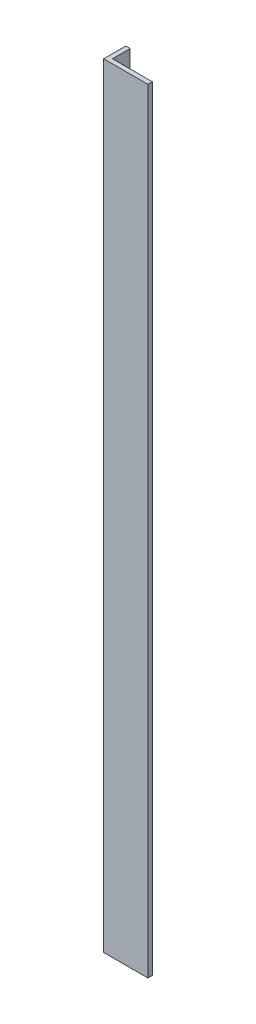
ISO-10303-21;
HEADER;
FILE_DESCRIPTION(('STEP AP214'),'2;1');
FILE_NAME('part.step','',(''),(''),'','','');
FILE_SCHEMA(('AUTOMOTIVE_DESIGN { 1 0 10303 214 1 1 1 1 }'));
ENDSEC;
DATA;
#1=APPLICATION_CONTEXT('core data for automotive mechanical design processes');
#2=APPLICATION_PROTOCOL_DEFINITION('international standard','automotive_design',2000,#1);
#3=PRODUCT_CONTEXT('',#1,'mechanical');
#4=PRODUCT('Part','Part','',(#3));
#5=PRODUCT_RELATED_PRODUCT_CATEGORY('part','',(#4));
#6=PRODUCT_DEFINITION_FORMATION('','',#4);
#7=PRODUCT_DEFINITION_CONTEXT('part definition',#1,'design');
#8=PRODUCT_DEFINITION('design','',#6,#7);
#9=PRODUCT_DEFINITION_SHAPE('','',#8);
#10=(LENGTH_UNIT() NAMED_UNIT(*) SI_UNIT(.MILLI.,.METRE.));
#11=(NAMED_UNIT(*) PLANE_ANGLE_UNIT() SI_UNIT($,.RADIAN.));
#12=(NAMED_UNIT(*) SI_UNIT($,.STERADIAN.) SOLID_ANGLE_UNIT());
#13=UNCERTAINTY_MEASURE_WITH_UNIT(LENGTH_MEASURE(1.E-05),#10,'distance_accuracy_value','');
#14=(GEOMETRIC_REPRESENTATION_CONTEXT(3) GLOBAL_UNCERTAINTY_ASSIGNED_CONTEXT((#13)) GLOBAL_UNIT_ASSIGNED_CONTEXT((#10,
#11,#12)) REPRESENTATION_CONTEXT('',''));
#15=CARTESIAN_POINT('',(0.,0.,0.));
#16=DIRECTION('',(0.,0.,1.));
#17=DIRECTION('',(1.,0.,0.));
#18=AXIS2_PLACEMENT_3D('',#15,#16,#17);
#19=CARTESIAN_POINT('',(20.,350.,0.));
#20=DIRECTION('',(0.,0.,-1.));
#21=DIRECTION('',(-1.,0.,0.));
#22=AXIS2_PLACEMENT_3D('',#19,#20,#21);
#23=PLANE('',#22);
#24=DIRECTION('',(1.,0.,0.));
#25=VECTOR('',#24,1.);
#26=CARTESIAN_POINT('',(20.,0.,0.));
#27=LINE('',#26,#25);
#28=CARTESIAN_POINT('',(0.,0.,0.));
#29=VERTEX_POINT('',#28);
#30=CARTESIAN_POINT('',(20.,0.,0.));
#31=VERTEX_POINT('',#30);
#32=EDGE_CURVE('E119',#29,#31,#27,.T.);
#33=ORIENTED_EDGE('',*,*,#32,.T.);
#34=DIRECTION('',(0.,-1.,0.));
#35=VECTOR('',#34,1.);
#36=CARTESIAN_POINT('',(20.,350.,0.));
#37=LINE('',#36,#35);
#38=CARTESIAN_POINT('',(20.,350.,0.));
#39=VERTEX_POINT('',#38);
#40=EDGE_CURVE('E11',#39,#31,#37,.T.);
#41=ORIENTED_EDGE('',*,*,#40,.F.);
#42=DIRECTION('',(1.,0.,0.));
#43=VECTOR('',#42,1.);
#44=CARTESIAN_POINT('',(20.,350.,0.));
#45=LINE('',#44,#43);
#46=CARTESIAN_POINT('',(0.,350.,0.));
#47=VERTEX_POINT('',#46);
#48=EDGE_CURVE('E130',#47,#39,#45,.T.);
#49=ORIENTED_EDGE('',*,*,#48,.F.);
#50=DIRECTION('',(0.,-1.,0.));
#51=VECTOR('',#50,1.);
#52=CARTESIAN_POINT('',(0.,350.,0.));
#53=LINE('',#52,#51);
#54=EDGE_CURVE('E115',#47,#29,#53,.T.);
#55=ORIENTED_EDGE('',*,*,#54,.T.);
#56=EDGE_LOOP('',(#33,#41,#49,#55));
#57=FACE_BOUND('',#56,.T.);
#58=ADVANCED_FACE('F35',(#57),#23,.F.);
#59=CARTESIAN_POINT('',(20.,350.,-2.));
#60=DIRECTION('',(-1.,0.,0.));
#61=DIRECTION('',(0.,0.,1.));
#62=AXIS2_PLACEMENT_3D('',#59,#60,#61);
#63=PLANE('',#62);
#64=DIRECTION('',(0.,0.,-1.));
#65=VECTOR('',#64,1.);
#66=CARTESIAN_POINT('',(20.,0.,-2.));
#67=LINE('',#66,#65);
#68=CARTESIAN_POINT('',(20.,0.,-2.));
#69=VERTEX_POINT('',#68);
#70=EDGE_CURVE('E122',#31,#69,#67,.T.);
#71=ORIENTED_EDGE('',*,*,#70,.T.);
#72=DIRECTION('',(0.,-1.,0.));
#73=VECTOR('',#72,1.);
#74=CARTESIAN_POINT('',(20.,350.,-2.));
#75=LINE('',#74,#73);
#76=CARTESIAN_POINT('',(20.,350.,-2.));
#77=VERTEX_POINT('',#76);
#78=EDGE_CURVE('E43',#77,#69,#75,.T.);
#79=ORIENTED_EDGE('',*,*,#78,.F.);
#80=DIRECTION('',(0.,0.,-1.));
#81=VECTOR('',#80,1.);
#82=CARTESIAN_POINT('',(20.,350.,-2.));
#83=LINE('',#82,#81);
#84=EDGE_CURVE('E88',#39,#77,#83,.T.);
#85=ORIENTED_EDGE('',*,*,#84,.F.);
#86=ORIENTED_EDGE('',*,*,#40,.T.);
#87=EDGE_LOOP('',(#71,#79,#85,#86));
#88=FACE_BOUND('',#87,.T.);
#89=ADVANCED_FACE('F159',(#88),#63,.F.);
#90=CARTESIAN_POINT('',(2.,350.,-2.));
#91=DIRECTION('',(0.,0.,1.));
#92=DIRECTION('',(1.,0.,0.));
#93=AXIS2_PLACEMENT_3D('',#90,#91,#92);
#94=PLANE('',#93);
#95=DIRECTION('',(-1.,0.,0.));
#96=VECTOR('',#95,1.);
#97=CARTESIAN_POINT('',(2.,0.,-2.));
#98=LINE('',#97,#96);
#99=CARTESIAN_POINT('',(2.,0.,-2.));
#100=VERTEX_POINT('',#99);
#101=EDGE_CURVE('E125',#69,#100,#98,.T.);
#102=ORIENTED_EDGE('',*,*,#101,.T.);
#103=DIRECTION('',(0.,-1.,0.));
#104=VECTOR('',#103,1.);
#105=CARTESIAN_POINT('',(2.,350.,-2.));
#106=LINE('',#105,#104);
#107=CARTESIAN_POINT('',(2.,350.,-2.));
#108=VERTEX_POINT('',#107);
#109=EDGE_CURVE('E110',#108,#100,#106,.T.);
#110=ORIENTED_EDGE('',*,*,#109,.F.);
#111=DIRECTION('',(-1.,0.,0.));
#112=VECTOR('',#111,1.);
#113=CARTESIAN_POINT('',(2.,350.,-2.));
#114=LINE('',#113,#112);
#115=EDGE_CURVE('E101',#77,#108,#114,.T.);
#116=ORIENTED_EDGE('',*,*,#115,.F.);
#117=ORIENTED_EDGE('',*,*,#78,.T.);
#118=EDGE_LOOP('',(#102,#110,#116,#117));
#119=FACE_BOUND('',#118,.T.);
#120=ADVANCED_FACE('F136',(#119),#94,.F.);
#121=CARTESIAN_POINT('',(2.,350.,-10.));
#122=DIRECTION('',(-1.,0.,0.));
#123=DIRECTION('',(0.,0.,1.));
#124=AXIS2_PLACEMENT_3D('',#121,#122,#123);
#125=PLANE('',#124);
#126=CARTESIAN_POINT('',(2.,344.,-5.99999999999998));
#127=DIRECTION('',(1.,0.,0.));
#128=DIRECTION('',(0.,0.,-1.));
#129=AXIS2_PLACEMENT_3D('',#126,#127,#128);
#130=CIRCLE('',#129,1.5);
#131=CARTESIAN_POINT('',(2.,344.,-7.49999999999998));
#132=VERTEX_POINT('',#131);
#133=EDGE_CURVE('E175',#132,#132,#130,.T.);
#134=ORIENTED_EDGE('',*,*,#133,.F.);
#135=EDGE_LOOP('',(#134));
#136=FACE_BOUND('',#135,.T.);
#137=CARTESIAN_POINT('',(2.,330.,-5.99999999999998));
#138=DIRECTION('',(1.,0.,0.));
#139=DIRECTION('',(0.,0.,-1.));
#140=AXIS2_PLACEMENT_3D('',#137,#138,#139);
#141=CIRCLE('',#140,1.5);
#142=CARTESIAN_POINT('',(2.,330.,-7.49999999999998));
#143=VERTEX_POINT('',#142);
#144=EDGE_CURVE('E179',#143,#143,#141,.T.);
#145=ORIENTED_EDGE('',*,*,#144,.F.);
#146=EDGE_LOOP('',(#145));
#147=FACE_BOUND('',#146,.T.);
#148=CARTESIAN_POINT('',(2.,6.00000000000001,-6.00000000000001));
#149=DIRECTION('',(1.,0.,0.));
#150=DIRECTION('',(0.,0.,-1.));
#151=AXIS2_PLACEMENT_3D('',#148,#149,#150);
#152=CIRCLE('',#151,1.49999999999999);
#153=CARTESIAN_POINT('',(2.,6.00000000000001,-7.49999999999999));
#154=VERTEX_POINT('',#153);
#155=EDGE_CURVE('E183',#154,#154,#152,.T.);
#156=ORIENTED_EDGE('',*,*,#155,.F.);
#157=EDGE_LOOP('',(#156));
#158=FACE_BOUND('',#157,.T.);
#159=CARTESIAN_POINT('',(2.,20.,-6.00000000000001));
#160=DIRECTION('',(1.,0.,0.));
#161=DIRECTION('',(0.,0.,-1.));
#162=AXIS2_PLACEMENT_3D('',#159,#160,#161);
#163=CIRCLE('',#162,1.49999999999999);
#164=CARTESIAN_POINT('',(2.,20.,-7.49999999999999));
#165=VERTEX_POINT('',#164);
#166=EDGE_CURVE('E186',#165,#165,#163,.T.);
#167=ORIENTED_EDGE('',*,*,#166,.F.);
#168=EDGE_LOOP('',(#167));
#169=FACE_BOUND('',#168,.T.);
#170=DIRECTION('',(0.,0.,-1.));
#171=VECTOR('',#170,1.);
#172=CARTESIAN_POINT('',(2.,0.,-10.));
#173=LINE('',#172,#171);
#174=CARTESIAN_POINT('',(2.,0.,-10.));
#175=VERTEX_POINT('',#174);
#176=EDGE_CURVE('E109',#100,#175,#173,.T.);
#177=ORIENTED_EDGE('',*,*,#176,.T.);
#178=DIRECTION('',(0.,-1.,0.));
#179=VECTOR('',#178,1.);
#180=CARTESIAN_POINT('',(2.,350.,-10.));
#181=LINE('',#180,#179);
#182=CARTESIAN_POINT('',(2.,350.,-10.));
#183=VERTEX_POINT('',#182);
#184=EDGE_CURVE('E106',#183,#175,#181,.T.);
#185=ORIENTED_EDGE('',*,*,#184,.F.);
#186=DIRECTION('',(0.,0.,-1.));
#187=VECTOR('',#186,1.);
#188=CARTESIAN_POINT('',(2.,350.,-10.));
#189=LINE('',#188,#187);
#190=EDGE_CURVE('E95',#108,#183,#189,.T.);
#191=ORIENTED_EDGE('',*,*,#190,.F.);
#192=ORIENTED_EDGE('',*,*,#109,.T.);
#193=EDGE_LOOP('',(#177,#185,#191,#192));
#194=FACE_BOUND('',#193,.T.);
#195=ADVANCED_FACE('F107',(#136,#147,#158,#169,#194),#125,.F.);
#196=CARTESIAN_POINT('',(0.,350.,-10.));
#197=DIRECTION('',(0.,0.,1.));
#198=DIRECTION('',(1.,0.,0.));
#199=AXIS2_PLACEMENT_3D('',#196,#197,#198);
#200=PLANE('',#199);
#201=DIRECTION('',(-1.,0.,0.));
#202=VECTOR('',#201,1.);
#203=CARTESIAN_POINT('',(0.,0.,-10.));
#204=LINE('',#203,#202);
#205=CARTESIAN_POINT('',(0.,0.,-10.));
#206=VERTEX_POINT('',#205);
#207=EDGE_CURVE('E74',#175,#206,#204,.T.);
#208=ORIENTED_EDGE('',*,*,#207,.T.);
#209=DIRECTION('',(0.,-1.,0.));
#210=VECTOR('',#209,1.);
#211=CARTESIAN_POINT('',(0.,350.,-10.));
#212=LINE('',#211,#210);
#213=CARTESIAN_POINT('',(0.,350.,-10.));
#214=VERTEX_POINT('',#213);
#215=EDGE_CURVE('E111',#214,#206,#212,.T.);
#216=ORIENTED_EDGE('',*,*,#215,.F.);
#217=DIRECTION('',(-1.,0.,0.));
#218=VECTOR('',#217,1.);
#219=CARTESIAN_POINT('',(0.,350.,-10.));
#220=LINE('',#219,#218);
#221=EDGE_CURVE('E99',#183,#214,#220,.T.);
#222=ORIENTED_EDGE('',*,*,#221,.F.);
#223=ORIENTED_EDGE('',*,*,#184,.T.);
#224=EDGE_LOOP('',(#208,#216,#222,#223));
#225=FACE_BOUND('',#224,.T.);
#226=ADVANCED_FACE('F113',(#225),#200,.F.);
#227=CARTESIAN_POINT('',(0.,350.,0.));
#228=DIRECTION('',(1.,0.,0.));
#229=DIRECTION('',(0.,0.,-1.));
#230=AXIS2_PLACEMENT_3D('',#227,#228,#229);
#231=PLANE('',#230);
#232=CARTESIAN_POINT('',(0.,344.,-5.99999999999998));
#233=DIRECTION('',(1.,0.,0.));
#234=DIRECTION('',(0.,0.,-1.));
#235=AXIS2_PLACEMENT_3D('',#232,#233,#234);
#236=CIRCLE('',#235,1.5);
#237=CARTESIAN_POINT('',(0.,344.,-7.49999999999998));
#238=VERTEX_POINT('',#237);
#239=EDGE_CURVE('E202',#238,#238,#236,.T.);
#240=ORIENTED_EDGE('',*,*,#239,.T.);
#241=EDGE_LOOP('',(#240));
#242=FACE_BOUND('',#241,.T.);
#243=CARTESIAN_POINT('',(0.,330.,-5.99999999999998));
#244=DIRECTION('',(1.,0.,0.));
#245=DIRECTION('',(0.,0.,-1.));
#246=AXIS2_PLACEMENT_3D('',#243,#244,#245);
#247=CIRCLE('',#246,1.5);
#248=CARTESIAN_POINT('',(0.,330.,-7.49999999999998));
#249=VERTEX_POINT('',#248);
#250=EDGE_CURVE('E198',#249,#249,#247,.T.);
#251=ORIENTED_EDGE('',*,*,#250,.T.);
#252=EDGE_LOOP('',(#251));
#253=FACE_BOUND('',#252,.T.);
#254=CARTESIAN_POINT('',(0.,6.00000000000001,-6.00000000000001));
#255=DIRECTION('',(1.,0.,0.));
#256=DIRECTION('',(0.,0.,-1.));
#257=AXIS2_PLACEMENT_3D('',#254,#255,#256);
#258=CIRCLE('',#257,1.49999999999999);
#259=CARTESIAN_POINT('',(0.,6.00000000000001,-7.49999999999999));
#260=VERTEX_POINT('',#259);
#261=EDGE_CURVE('E188',#260,#260,#258,.T.);
#262=ORIENTED_EDGE('',*,*,#261,.T.);
#263=EDGE_LOOP('',(#262));
#264=FACE_BOUND('',#263,.T.);
#265=CARTESIAN_POINT('',(0.,20.,-6.00000000000001));
#266=DIRECTION('',(1.,0.,0.));
#267=DIRECTION('',(0.,0.,-1.));
#268=AXIS2_PLACEMENT_3D('',#265,#266,#267);
#269=CIRCLE('',#268,1.49999999999999);
#270=CARTESIAN_POINT('',(0.,20.,-7.49999999999999));
#271=VERTEX_POINT('',#270);
#272=EDGE_CURVE('E123',#271,#271,#269,.T.);
#273=ORIENTED_EDGE('',*,*,#272,.T.);
#274=EDGE_LOOP('',(#273));
#275=FACE_BOUND('',#274,.T.);
#276=DIRECTION('',(0.,0.,1.));
#277=VECTOR('',#276,1.);
#278=CARTESIAN_POINT('',(0.,0.,0.));
#279=LINE('',#278,#277);
#280=EDGE_CURVE('E80',#206,#29,#279,.T.);
#281=ORIENTED_EDGE('',*,*,#280,.T.);
#282=ORIENTED_EDGE('',*,*,#54,.F.);
#283=DIRECTION('',(0.,0.,1.));
#284=VECTOR('',#283,1.);
#285=CARTESIAN_POINT('',(0.,350.,0.));
#286=LINE('',#285,#284);
#287=EDGE_CURVE('E51',#214,#47,#286,.T.);
#288=ORIENTED_EDGE('',*,*,#287,.F.);
#289=ORIENTED_EDGE('',*,*,#215,.T.);
#290=EDGE_LOOP('',(#281,#282,#288,#289));
#291=FACE_BOUND('',#290,.T.);
#292=ADVANCED_FACE('F143',(#242,#253,#264,#275,#291),#231,.F.);
#293=CARTESIAN_POINT('',(0.,350.,0.));
#294=DIRECTION('',(0.,-1.,0.));
#295=DIRECTION('',(0.,0.,-1.));
#296=AXIS2_PLACEMENT_3D('',#293,#294,#295);
#297=PLANE('',#296);
#298=ORIENTED_EDGE('',*,*,#48,.T.);
#299=ORIENTED_EDGE('',*,*,#84,.T.);
#300=ORIENTED_EDGE('',*,*,#115,.T.);
#301=ORIENTED_EDGE('',*,*,#190,.T.);
#302=ORIENTED_EDGE('',*,*,#221,.T.);
#303=ORIENTED_EDGE('',*,*,#287,.T.);
#304=EDGE_LOOP('',(#298,#299,#300,#301,#302,#303));
#305=FACE_BOUND('',#304,.T.);
#306=ADVANCED_FACE('F97',(#305),#297,.F.);
#307=CARTESIAN_POINT('',(0.,0.,0.));
#308=DIRECTION('',(0.,-1.,0.));
#309=DIRECTION('',(0.,0.,-1.));
#310=AXIS2_PLACEMENT_3D('',#307,#308,#309);
#311=PLANE('',#310);
#312=ORIENTED_EDGE('',*,*,#32,.F.);
#313=ORIENTED_EDGE('',*,*,#280,.F.);
#314=ORIENTED_EDGE('',*,*,#207,.F.);
#315=ORIENTED_EDGE('',*,*,#176,.F.);
#316=ORIENTED_EDGE('',*,*,#101,.F.);
#317=ORIENTED_EDGE('',*,*,#70,.F.);
#318=EDGE_LOOP('',(#312,#313,#314,#315,#316,#317));
#319=FACE_BOUND('',#318,.T.);
#320=ADVANCED_FACE('F139',(#319),#311,.T.);
#321=CARTESIAN_POINT('',(2.,20.,-6.00000000000001));
#322=DIRECTION('',(1.,0.,0.));
#323=DIRECTION('',(0.,0.,-1.));
#324=AXIS2_PLACEMENT_3D('',#321,#322,#323);
#325=CYLINDRICAL_SURFACE('',#324,1.49999999999999);
#326=ORIENTED_EDGE('',*,*,#272,.F.);
#327=EDGE_LOOP('',(#326));
#328=FACE_BOUND('',#327,.T.);
#329=ORIENTED_EDGE('',*,*,#166,.T.);
#330=EDGE_LOOP('',(#329));
#331=FACE_BOUND('',#330,.T.);
#332=ADVANCED_FACE('F220',(#328,#331),#325,.F.);
#333=CARTESIAN_POINT('',(2.,6.00000000000001,-6.00000000000001));
#334=DIRECTION('',(1.,0.,0.));
#335=DIRECTION('',(0.,0.,-1.));
#336=AXIS2_PLACEMENT_3D('',#333,#334,#335);
#337=CYLINDRICAL_SURFACE('',#336,1.49999999999999);
#338=ORIENTED_EDGE('',*,*,#261,.F.);
#339=EDGE_LOOP('',(#338));
#340=FACE_BOUND('',#339,.T.);
#341=ORIENTED_EDGE('',*,*,#155,.T.);
#342=EDGE_LOOP('',(#341));
#343=FACE_BOUND('',#342,.T.);
#344=ADVANCED_FACE('F213',(#340,#343),#337,.F.);
#345=CARTESIAN_POINT('',(2.,330.,-5.99999999999998));
#346=DIRECTION('',(1.,0.,0.));
#347=DIRECTION('',(0.,0.,-1.));
#348=AXIS2_PLACEMENT_3D('',#345,#346,#347);
#349=CYLINDRICAL_SURFACE('',#348,1.5);
#350=ORIENTED_EDGE('',*,*,#250,.F.);
#351=EDGE_LOOP('',(#350));
#352=FACE_BOUND('',#351,.T.);
#353=ORIENTED_EDGE('',*,*,#144,.T.);
#354=EDGE_LOOP('',(#353));
#355=FACE_BOUND('',#354,.T.);
#356=ADVANCED_FACE('F207',(#352,#355),#349,.F.);
#357=CARTESIAN_POINT('',(2.,344.,-5.99999999999998));
#358=DIRECTION('',(1.,0.,0.));
#359=DIRECTION('',(0.,0.,-1.));
#360=AXIS2_PLACEMENT_3D('',#357,#358,#359);
#361=CYLINDRICAL_SURFACE('',#360,1.5);
#362=ORIENTED_EDGE('',*,*,#239,.F.);
#363=EDGE_LOOP('',(#362));
#364=FACE_BOUND('',#363,.T.);
#365=ORIENTED_EDGE('',*,*,#133,.T.);
#366=EDGE_LOOP('',(#365));
#367=FACE_BOUND('',#366,.T.);
#368=ADVANCED_FACE('F205',(#364,#367),#361,.F.);
#369=CLOSED_SHELL('',(#58,#89,#120,#195,#226,#292,#306,#320,#332,#344,#356,#368));
#370=MANIFOLD_SOLID_BREP('B2',#369);
#371=ADVANCED_BREP_SHAPE_REPRESENTATION('',(#18,#370),#14);
#372=SHAPE_DEFINITION_REPRESENTATION(#9,#371);
ENDSEC;
END-ISO-10303-21;
